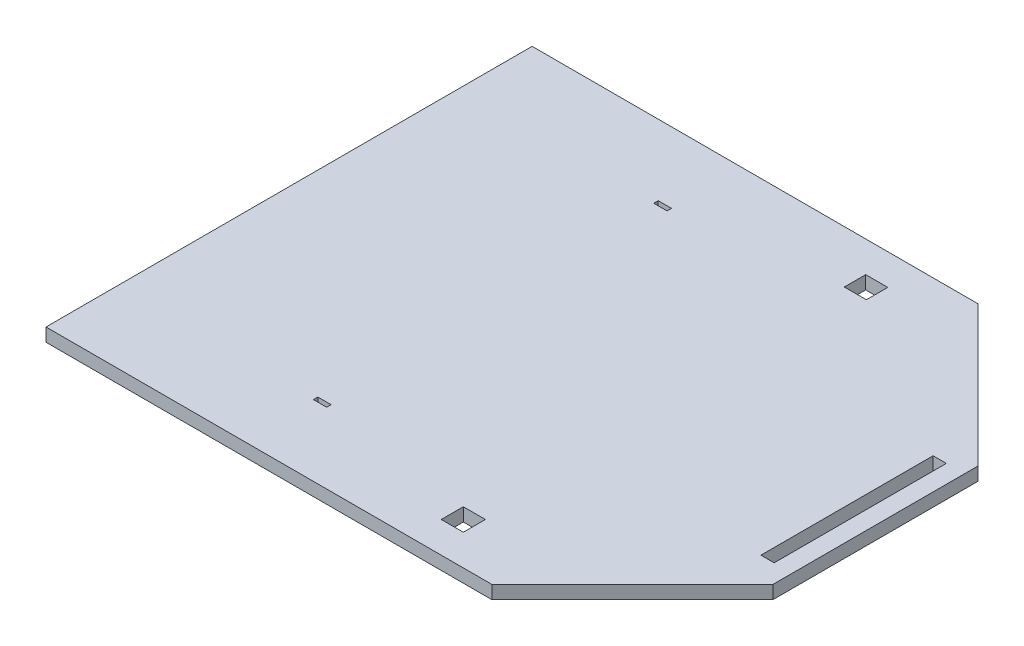
ISO-10303-21;
HEADER;
FILE_DESCRIPTION(('STEP AP214'),'2;1');
FILE_NAME('part.step','',(''),(''),'','','');
FILE_SCHEMA(('AUTOMOTIVE_DESIGN { 1 0 10303 214 1 1 1 1 }'));
ENDSEC;
DATA;
#1=APPLICATION_CONTEXT('core data for automotive mechanical design processes');
#2=APPLICATION_PROTOCOL_DEFINITION('international standard','automotive_design',2000,#1);
#3=PRODUCT_CONTEXT('',#1,'mechanical');
#4=PRODUCT('Part','Part','',(#3));
#5=PRODUCT_RELATED_PRODUCT_CATEGORY('part','',(#4));
#6=PRODUCT_DEFINITION_FORMATION('','',#4);
#7=PRODUCT_DEFINITION_CONTEXT('part definition',#1,'design');
#8=PRODUCT_DEFINITION('design','',#6,#7);
#9=PRODUCT_DEFINITION_SHAPE('','',#8);
#10=(LENGTH_UNIT() NAMED_UNIT(*) SI_UNIT(.MILLI.,.METRE.));
#11=(NAMED_UNIT(*) PLANE_ANGLE_UNIT() SI_UNIT($,.RADIAN.));
#12=(NAMED_UNIT(*) SI_UNIT($,.STERADIAN.) SOLID_ANGLE_UNIT());
#13=UNCERTAINTY_MEASURE_WITH_UNIT(LENGTH_MEASURE(1.E-05),#10,'distance_accuracy_value','');
#14=(GEOMETRIC_REPRESENTATION_CONTEXT(3) GLOBAL_UNCERTAINTY_ASSIGNED_CONTEXT((#13)) GLOBAL_UNIT_ASSIGNED_CONTEXT((#10,
#11,#12)) REPRESENTATION_CONTEXT('',''));
#15=CARTESIAN_POINT('',(0.,0.,0.));
#16=DIRECTION('',(0.,0.,1.));
#17=DIRECTION('',(1.,0.,0.));
#18=AXIS2_PLACEMENT_3D('',#15,#16,#17);
#19=CARTESIAN_POINT('',(0.,3.,0.));
#20=DIRECTION('',(0.,-1.,0.));
#21=DIRECTION('',(0.,0.,-1.));
#22=AXIS2_PLACEMENT_3D('',#19,#20,#21);
#23=PLANE('',#22);
#24=DIRECTION('',(0.,0.,1.));
#25=VECTOR('',#24,1.);
#26=CARTESIAN_POINT('',(38.0418387839541,3.,-84.1097284482659));
#27=LINE('',#26,#25);
#28=CARTESIAN_POINT('',(38.0418387839541,3.,-84.1097284482659));
#29=VERTEX_POINT('',#28);
#30=CARTESIAN_POINT('',(38.0418387839541,3.,-79.2576621948174));
#31=VERTEX_POINT('',#30);
#32=EDGE_CURVE('E242',#29,#31,#27,.T.);
#33=ORIENTED_EDGE('',*,*,#32,.F.);
#34=DIRECTION('',(-1.,0.,0.));
#35=VECTOR('',#34,1.);
#36=CARTESIAN_POINT('',(38.0418387839541,3.,-84.1097284482659));
#37=LINE('',#36,#35);
#38=CARTESIAN_POINT('',(43.0418387839541,3.,-84.1097284482659));
#39=VERTEX_POINT('',#38);
#40=EDGE_CURVE('E250',#39,#29,#37,.T.);
#41=ORIENTED_EDGE('',*,*,#40,.F.);
#42=DIRECTION('',(0.,0.,-1.));
#43=VECTOR('',#42,1.);
#44=CARTESIAN_POINT('',(43.0418387839541,3.,-84.1097284482659));
#45=LINE('',#44,#43);
#46=CARTESIAN_POINT('',(43.0418387839541,3.,-79.2576621948174));
#47=VERTEX_POINT('',#46);
#48=EDGE_CURVE('E247',#47,#39,#45,.T.);
#49=ORIENTED_EDGE('',*,*,#48,.F.);
#50=DIRECTION('',(1.,0.,0.));
#51=VECTOR('',#50,1.);
#52=CARTESIAN_POINT('',(38.0418387839541,3.,-79.2576621948174));
#53=LINE('',#52,#51);
#54=EDGE_CURVE('E244',#31,#47,#53,.T.);
#55=ORIENTED_EDGE('',*,*,#54,.F.);
#56=EDGE_LOOP('',(#33,#41,#49,#55));
#57=FACE_BOUND('',#56,.T.);
#58=DIRECTION('',(0.,0.,1.));
#59=VECTOR('',#58,1.);
#60=CARTESIAN_POINT('',(0.0418387839540746,3.,-75.1097284482659));
#61=LINE('',#60,#59);
#62=CARTESIAN_POINT('',(0.0418387839540746,3.,-75.1097284482659));
#63=VERTEX_POINT('',#62);
#64=CARTESIAN_POINT('',(0.0418387839540742,3.,-74.1097284482659));
#65=VERTEX_POINT('',#64);
#66=EDGE_CURVE('E304',#63,#65,#61,.T.);
#67=ORIENTED_EDGE('',*,*,#66,.F.);
#68=DIRECTION('',(-1.,0.,0.));
#69=VECTOR('',#68,1.);
#70=CARTESIAN_POINT('',(0.0418387839540746,3.,-75.1097284482659));
#71=LINE('',#70,#69);
#72=CARTESIAN_POINT('',(3.04183878395407,3.,-75.1097284482659));
#73=VERTEX_POINT('',#72);
#74=EDGE_CURVE('E312',#73,#63,#71,.T.);
#75=ORIENTED_EDGE('',*,*,#74,.F.);
#76=DIRECTION('',(0.,0.,-1.));
#77=VECTOR('',#76,1.);
#78=CARTESIAN_POINT('',(3.04183878395407,3.,-75.1097284482659));
#79=LINE('',#78,#77);
#80=CARTESIAN_POINT('',(3.04183878395407,3.,-74.1097284482659));
#81=VERTEX_POINT('',#80);
#82=EDGE_CURVE('E309',#81,#73,#79,.T.);
#83=ORIENTED_EDGE('',*,*,#82,.F.);
#84=DIRECTION('',(1.,0.,0.));
#85=VECTOR('',#84,1.);
#86=CARTESIAN_POINT('',(0.0418387839540742,3.,-74.1097284482659));
#87=LINE('',#86,#85);
#88=EDGE_CURVE('E306',#65,#81,#87,.T.);
#89=ORIENTED_EDGE('',*,*,#88,.F.);
#90=EDGE_LOOP('',(#67,#75,#83,#89));
#91=FACE_BOUND('',#90,.T.);
#92=DIRECTION('',(1.,0.,0.));
#93=VECTOR('',#92,1.);
#94=CARTESIAN_POINT('',(56.4572329049881,3.,18.9867210222612));
#95=LINE('',#94,#93);
#96=CARTESIAN_POINT('',(-44.5199360312681,3.,18.9867210222612));
#97=VERTEX_POINT('',#96);
#98=CARTESIAN_POINT('',(56.4572329049881,3.,18.9867210222612));
#99=VERTEX_POINT('',#98);
#100=EDGE_CURVE('E366',#97,#99,#95,.T.);
#101=ORIENTED_EDGE('',*,*,#100,.T.);
#102=DIRECTION('',(0.707106781186551,0.,-0.707106781186544));
#103=VECTOR('',#102,1.);
#104=CARTESIAN_POINT('',(88.2915814195495,3.,-12.8476274922999));
#105=LINE('',#104,#103);
#106=CARTESIAN_POINT('',(88.2915814195495,3.,-12.8476274922999));
#107=VERTEX_POINT('',#106);
#108=EDGE_CURVE('E369',#99,#107,#105,.T.);
#109=ORIENTED_EDGE('',*,*,#108,.T.);
#110=DIRECTION('',(0.,0.,-1.));
#111=VECTOR('',#110,1.);
#112=CARTESIAN_POINT('',(88.2915814195495,3.,-59.2899232948702));
#113=LINE('',#112,#111);
#114=CARTESIAN_POINT('',(88.2915814195495,3.,-59.2899232948702));
#115=VERTEX_POINT('',#114);
#116=EDGE_CURVE('E372',#107,#115,#113,.T.);
#117=ORIENTED_EDGE('',*,*,#116,.T.);
#118=DIRECTION('',(-0.707106781186548,0.,-0.707106781186547));
#119=VECTOR('',#118,1.);
#120=CARTESIAN_POINT('',(56.4717762661537,3.,-91.1097284482659));
#121=LINE('',#120,#119);
#122=CARTESIAN_POINT('',(56.4717762661537,3.,-91.1097284482659));
#123=VERTEX_POINT('',#122);
#124=EDGE_CURVE('E374',#115,#123,#121,.T.);
#125=ORIENTED_EDGE('',*,*,#124,.T.);
#126=DIRECTION('',(-1.,0.,0.));
#127=VECTOR('',#126,1.);
#128=CARTESIAN_POINT('',(-44.5199360312681,3.,-91.1097284482659));
#129=LINE('',#128,#127);
#130=CARTESIAN_POINT('',(-44.5199360312681,3.,-91.1097284482659));
#131=VERTEX_POINT('',#130);
#132=EDGE_CURVE('E376',#123,#131,#129,.T.);
#133=ORIENTED_EDGE('',*,*,#132,.T.);
#134=DIRECTION('',(0.,0.,1.));
#135=VECTOR('',#134,1.);
#136=CARTESIAN_POINT('',(-44.5199360312681,3.,18.9867210222612));
#137=LINE('',#136,#135);
#138=EDGE_CURVE('E378',#131,#97,#137,.T.);
#139=ORIENTED_EDGE('',*,*,#138,.T.);
#140=EDGE_LOOP('',(#101,#109,#117,#125,#133,#139));
#141=FACE_BOUND('',#140,.T.);
#142=DIRECTION('',(0.,0.,1.));
#143=VECTOR('',#142,1.);
#144=CARTESIAN_POINT('',(0.,3.,1.94585934018356));
#145=LINE('',#144,#143);
#146=CARTESIAN_POINT('',(0.,3.,1.94585934018356));
#147=VERTEX_POINT('',#146);
#148=CARTESIAN_POINT('',(0.,3.,2.94585934018356));
#149=VERTEX_POINT('',#148);
#150=EDGE_CURVE('E335',#147,#149,#145,.T.);
#151=ORIENTED_EDGE('',*,*,#150,.F.);
#152=DIRECTION('',(-1.,0.,0.));
#153=VECTOR('',#152,1.);
#154=CARTESIAN_POINT('',(0.,3.,1.94585934018356));
#155=LINE('',#154,#153);
#156=CARTESIAN_POINT('',(3.,3.,1.94585934018356));
#157=VERTEX_POINT('',#156);
#158=EDGE_CURVE('E343',#157,#147,#155,.T.);
#159=ORIENTED_EDGE('',*,*,#158,.F.);
#160=DIRECTION('',(0.,0.,-1.));
#161=VECTOR('',#160,1.);
#162=CARTESIAN_POINT('',(3.,3.,1.94585934018356));
#163=LINE('',#162,#161);
#164=CARTESIAN_POINT('',(3.,3.,2.94585934018356));
#165=VERTEX_POINT('',#164);
#166=EDGE_CURVE('E340',#165,#157,#163,.T.);
#167=ORIENTED_EDGE('',*,*,#166,.F.);
#168=DIRECTION('',(1.,0.,0.));
#169=VECTOR('',#168,1.);
#170=CARTESIAN_POINT('',(0.,3.,2.94585934018356));
#171=LINE('',#170,#169);
#172=EDGE_CURVE('E337',#149,#165,#171,.T.);
#173=ORIENTED_EDGE('',*,*,#172,.F.);
#174=EDGE_LOOP('',(#151,#159,#167,#173));
#175=FACE_BOUND('',#174,.T.);
#176=DIRECTION('',(0.,0.,1.));
#177=VECTOR('',#176,1.);
#178=CARTESIAN_POINT('',(81.1981341241439,3.,-56.2169702862389));
#179=LINE('',#178,#177);
#180=CARTESIAN_POINT('',(81.1981341241439,3.,-56.2169702862389));
#181=VERTEX_POINT('',#180);
#182=CARTESIAN_POINT('',(81.1981341241439,3.,-17.2169702862389));
#183=VERTEX_POINT('',#182);
#184=EDGE_CURVE('E273',#181,#183,#179,.T.);
#185=ORIENTED_EDGE('',*,*,#184,.F.);
#186=DIRECTION('',(-1.,0.,0.));
#187=VECTOR('',#186,1.);
#188=CARTESIAN_POINT('',(81.1981341241439,3.,-56.2169702862389));
#189=LINE('',#188,#187);
#190=CARTESIAN_POINT('',(84.1981341241439,3.,-56.2169702862389));
#191=VERTEX_POINT('',#190);
#192=EDGE_CURVE('E281',#191,#181,#189,.T.);
#193=ORIENTED_EDGE('',*,*,#192,.F.);
#194=DIRECTION('',(0.,0.,-1.));
#195=VECTOR('',#194,1.);
#196=CARTESIAN_POINT('',(84.1981341241439,3.,-56.2169702862389));
#197=LINE('',#196,#195);
#198=CARTESIAN_POINT('',(84.1981341241439,3.,-17.2169702862389));
#199=VERTEX_POINT('',#198);
#200=EDGE_CURVE('E278',#199,#191,#197,.T.);
#201=ORIENTED_EDGE('',*,*,#200,.F.);
#202=DIRECTION('',(1.,0.,0.));
#203=VECTOR('',#202,1.);
#204=CARTESIAN_POINT('',(81.1981341241439,3.,-17.2169702862389));
#205=LINE('',#204,#203);
#206=EDGE_CURVE('E275',#183,#199,#205,.T.);
#207=ORIENTED_EDGE('',*,*,#206,.F.);
#208=EDGE_LOOP('',(#185,#193,#201,#207));
#209=FACE_BOUND('',#208,.T.);
#210=DIRECTION('',(0.,0.,1.));
#211=VECTOR('',#210,1.);
#212=CARTESIAN_POINT('',(38.,3.,6.98672102226119));
#213=LINE('',#212,#211);
#214=CARTESIAN_POINT('',(38.,3.,6.98672102226119));
#215=VERTEX_POINT('',#214);
#216=CARTESIAN_POINT('',(38.,3.,11.9867210222612));
#217=VERTEX_POINT('',#216);
#218=EDGE_CURVE('E206',#215,#217,#213,.T.);
#219=ORIENTED_EDGE('',*,*,#218,.F.);
#220=DIRECTION('',(-1.,0.,0.));
#221=VECTOR('',#220,1.);
#222=CARTESIAN_POINT('',(38.,3.,6.98672102226119));
#223=LINE('',#222,#221);
#224=CARTESIAN_POINT('',(43.,3.,6.98672102226119));
#225=VERTEX_POINT('',#224);
#226=EDGE_CURVE('E228',#225,#215,#223,.T.);
#227=ORIENTED_EDGE('',*,*,#226,.F.);
#228=DIRECTION('',(0.,0.,-1.));
#229=VECTOR('',#228,1.);
#230=CARTESIAN_POINT('',(43.,3.,6.98672102226119));
#231=LINE('',#230,#229);
#232=CARTESIAN_POINT('',(43.,3.,11.9867210222612));
#233=VERTEX_POINT('',#232);
#234=EDGE_CURVE('E226',#233,#225,#231,.T.);
#235=ORIENTED_EDGE('',*,*,#234,.F.);
#236=DIRECTION('',(1.,0.,0.));
#237=VECTOR('',#236,1.);
#238=CARTESIAN_POINT('',(38.,3.,11.9867210222612));
#239=LINE('',#238,#237);
#240=EDGE_CURVE('E214',#217,#233,#239,.T.);
#241=ORIENTED_EDGE('',*,*,#240,.F.);
#242=EDGE_LOOP('',(#219,#227,#235,#241));
#243=FACE_BOUND('',#242,.T.);
#244=ADVANCED_FACE('F33',(#57,#91,#141,#175,#209,#243),#23,.F.);
#245=CARTESIAN_POINT('',(0.,0.,0.));
#246=DIRECTION('',(0.,-1.,0.));
#247=DIRECTION('',(0.,0.,-1.));
#248=AXIS2_PLACEMENT_3D('',#245,#246,#247);
#249=PLANE('',#248);
#250=DIRECTION('',(1.,0.,0.));
#251=VECTOR('',#250,1.);
#252=CARTESIAN_POINT('',(56.4572329049881,0.,18.9867210222612));
#253=LINE('',#252,#251);
#254=CARTESIAN_POINT('',(-44.5199360312681,0.,18.9867210222612));
#255=VERTEX_POINT('',#254);
#256=CARTESIAN_POINT('',(56.4572329049881,0.,18.9867210222612));
#257=VERTEX_POINT('',#256);
#258=EDGE_CURVE('E365',#255,#257,#253,.T.);
#259=ORIENTED_EDGE('',*,*,#258,.F.);
#260=DIRECTION('',(0.,0.,1.));
#261=VECTOR('',#260,1.);
#262=CARTESIAN_POINT('',(-44.5199360312681,0.,18.9867210222612));
#263=LINE('',#262,#261);
#264=CARTESIAN_POINT('',(-44.5199360312681,0.,-91.1097284482659));
#265=VERTEX_POINT('',#264);
#266=EDGE_CURVE('E370',#265,#255,#263,.T.);
#267=ORIENTED_EDGE('',*,*,#266,.F.);
#268=DIRECTION('',(-1.,0.,0.));
#269=VECTOR('',#268,1.);
#270=CARTESIAN_POINT('',(-44.5199360312681,0.,-91.1097284482659));
#271=LINE('',#270,#269);
#272=CARTESIAN_POINT('',(56.4717762661537,0.,-91.1097284482659));
#273=VERTEX_POINT('',#272);
#274=EDGE_CURVE('E389',#273,#265,#271,.T.);
#275=ORIENTED_EDGE('',*,*,#274,.F.);
#276=DIRECTION('',(-0.707106781186548,0.,-0.707106781186547));
#277=VECTOR('',#276,1.);
#278=CARTESIAN_POINT('',(56.4717762661537,0.,-91.1097284482659));
#279=LINE('',#278,#277);
#280=CARTESIAN_POINT('',(88.2915814195495,0.,-59.2899232948702));
#281=VERTEX_POINT('',#280);
#282=EDGE_CURVE('E387',#281,#273,#279,.T.);
#283=ORIENTED_EDGE('',*,*,#282,.F.);
#284=DIRECTION('',(0.,0.,-1.));
#285=VECTOR('',#284,1.);
#286=CARTESIAN_POINT('',(88.2915814195495,0.,-59.2899232948702));
#287=LINE('',#286,#285);
#288=CARTESIAN_POINT('',(88.2915814195495,0.,-12.8476274922999));
#289=VERTEX_POINT('',#288);
#290=EDGE_CURVE('E385',#289,#281,#287,.T.);
#291=ORIENTED_EDGE('',*,*,#290,.F.);
#292=DIRECTION('',(0.707106781186551,0.,-0.707106781186544));
#293=VECTOR('',#292,1.);
#294=CARTESIAN_POINT('',(88.2915814195495,0.,-12.8476274922999));
#295=LINE('',#294,#293);
#296=EDGE_CURVE('E383',#257,#289,#295,.T.);
#297=ORIENTED_EDGE('',*,*,#296,.F.);
#298=EDGE_LOOP('',(#259,#267,#275,#283,#291,#297));
#299=FACE_BOUND('',#298,.T.);
#300=DIRECTION('',(-1.,0.,0.));
#301=VECTOR('',#300,1.);
#302=CARTESIAN_POINT('',(0.,0.,1.94585934018356));
#303=LINE('',#302,#301);
#304=CARTESIAN_POINT('',(3.,0.,1.94585934018356));
#305=VERTEX_POINT('',#304);
#306=CARTESIAN_POINT('',(0.,0.,1.94585934018356));
#307=VERTEX_POINT('',#306);
#308=EDGE_CURVE('E338',#305,#307,#303,.T.);
#309=ORIENTED_EDGE('',*,*,#308,.T.);
#310=DIRECTION('',(0.,0.,1.));
#311=VECTOR('',#310,1.);
#312=CARTESIAN_POINT('',(0.,0.,1.94585934018356));
#313=LINE('',#312,#311);
#314=CARTESIAN_POINT('',(0.,0.,2.94585934018356));
#315=VERTEX_POINT('',#314);
#316=EDGE_CURVE('E334',#307,#315,#313,.T.);
#317=ORIENTED_EDGE('',*,*,#316,.T.);
#318=DIRECTION('',(1.,0.,0.));
#319=VECTOR('',#318,1.);
#320=CARTESIAN_POINT('',(0.,0.,2.94585934018356));
#321=LINE('',#320,#319);
#322=CARTESIAN_POINT('',(3.,0.,2.94585934018356));
#323=VERTEX_POINT('',#322);
#324=EDGE_CURVE('E348',#315,#323,#321,.T.);
#325=ORIENTED_EDGE('',*,*,#324,.T.);
#326=DIRECTION('',(0.,0.,-1.));
#327=VECTOR('',#326,1.);
#328=CARTESIAN_POINT('',(3.,0.,1.94585934018356));
#329=LINE('',#328,#327);
#330=EDGE_CURVE('E351',#323,#305,#329,.T.);
#331=ORIENTED_EDGE('',*,*,#330,.T.);
#332=EDGE_LOOP('',(#309,#317,#325,#331));
#333=FACE_BOUND('',#332,.T.);
#334=DIRECTION('',(-1.,0.,0.));
#335=VECTOR('',#334,1.);
#336=CARTESIAN_POINT('',(0.0418387839540746,0.,-75.1097284482659));
#337=LINE('',#336,#335);
#338=CARTESIAN_POINT('',(3.04183878395407,0.,-75.1097284482659));
#339=VERTEX_POINT('',#338);
#340=CARTESIAN_POINT('',(0.0418387839540746,0.,-75.1097284482659));
#341=VERTEX_POINT('',#340);
#342=EDGE_CURVE('E307',#339,#341,#337,.T.);
#343=ORIENTED_EDGE('',*,*,#342,.T.);
#344=DIRECTION('',(0.,0.,1.));
#345=VECTOR('',#344,1.);
#346=CARTESIAN_POINT('',(0.0418387839540746,0.,-75.1097284482659));
#347=LINE('',#346,#345);
#348=CARTESIAN_POINT('',(0.0418387839540742,0.,-74.1097284482659));
#349=VERTEX_POINT('',#348);
#350=EDGE_CURVE('E303',#341,#349,#347,.T.);
#351=ORIENTED_EDGE('',*,*,#350,.T.);
#352=DIRECTION('',(1.,0.,0.));
#353=VECTOR('',#352,1.);
#354=CARTESIAN_POINT('',(0.0418387839540742,0.,-74.1097284482659));
#355=LINE('',#354,#353);
#356=CARTESIAN_POINT('',(3.04183878395407,0.,-74.1097284482659));
#357=VERTEX_POINT('',#356);
#358=EDGE_CURVE('E317',#349,#357,#355,.T.);
#359=ORIENTED_EDGE('',*,*,#358,.T.);
#360=DIRECTION('',(0.,0.,-1.));
#361=VECTOR('',#360,1.);
#362=CARTESIAN_POINT('',(3.04183878395407,0.,-75.1097284482659));
#363=LINE('',#362,#361);
#364=EDGE_CURVE('E320',#357,#339,#363,.T.);
#365=ORIENTED_EDGE('',*,*,#364,.T.);
#366=EDGE_LOOP('',(#343,#351,#359,#365));
#367=FACE_BOUND('',#366,.T.);
#368=DIRECTION('',(-1.,0.,0.));
#369=VECTOR('',#368,1.);
#370=CARTESIAN_POINT('',(81.1981341241439,0.,-56.2169702862389));
#371=LINE('',#370,#369);
#372=CARTESIAN_POINT('',(84.1981341241439,0.,-56.2169702862389));
#373=VERTEX_POINT('',#372);
#374=CARTESIAN_POINT('',(81.1981341241439,0.,-56.2169702862389));
#375=VERTEX_POINT('',#374);
#376=EDGE_CURVE('E276',#373,#375,#371,.T.);
#377=ORIENTED_EDGE('',*,*,#376,.T.);
#378=DIRECTION('',(0.,0.,1.));
#379=VECTOR('',#378,1.);
#380=CARTESIAN_POINT('',(81.1981341241439,0.,-56.2169702862389));
#381=LINE('',#380,#379);
#382=CARTESIAN_POINT('',(81.1981341241439,0.,-17.2169702862389));
#383=VERTEX_POINT('',#382);
#384=EDGE_CURVE('E272',#375,#383,#381,.T.);
#385=ORIENTED_EDGE('',*,*,#384,.T.);
#386=DIRECTION('',(1.,0.,0.));
#387=VECTOR('',#386,1.);
#388=CARTESIAN_POINT('',(81.1981341241439,0.,-17.2169702862389));
#389=LINE('',#388,#387);
#390=CARTESIAN_POINT('',(84.1981341241439,0.,-17.2169702862389));
#391=VERTEX_POINT('',#390);
#392=EDGE_CURVE('E286',#383,#391,#389,.T.);
#393=ORIENTED_EDGE('',*,*,#392,.T.);
#394=DIRECTION('',(0.,0.,-1.));
#395=VECTOR('',#394,1.);
#396=CARTESIAN_POINT('',(84.1981341241439,0.,-56.2169702862389));
#397=LINE('',#396,#395);
#398=EDGE_CURVE('E289',#391,#373,#397,.T.);
#399=ORIENTED_EDGE('',*,*,#398,.T.);
#400=EDGE_LOOP('',(#377,#385,#393,#399));
#401=FACE_BOUND('',#400,.T.);
#402=DIRECTION('',(-1.,0.,0.));
#403=VECTOR('',#402,1.);
#404=CARTESIAN_POINT('',(38.0418387839541,0.,-84.1097284482659));
#405=LINE('',#404,#403);
#406=CARTESIAN_POINT('',(43.0418387839541,0.,-84.1097284482659));
#407=VERTEX_POINT('',#406);
#408=CARTESIAN_POINT('',(38.0418387839541,0.,-84.1097284482659));
#409=VERTEX_POINT('',#408);
#410=EDGE_CURVE('E245',#407,#409,#405,.T.);
#411=ORIENTED_EDGE('',*,*,#410,.T.);
#412=DIRECTION('',(0.,0.,1.));
#413=VECTOR('',#412,1.);
#414=CARTESIAN_POINT('',(38.0418387839541,0.,-84.1097284482659));
#415=LINE('',#414,#413);
#416=CARTESIAN_POINT('',(38.0418387839541,0.,-79.2576621948174));
#417=VERTEX_POINT('',#416);
#418=EDGE_CURVE('E222',#409,#417,#415,.T.);
#419=ORIENTED_EDGE('',*,*,#418,.T.);
#420=DIRECTION('',(1.,0.,0.));
#421=VECTOR('',#420,1.);
#422=CARTESIAN_POINT('',(38.0418387839541,0.,-79.2576621948174));
#423=LINE('',#422,#421);
#424=CARTESIAN_POINT('',(43.0418387839541,0.,-79.2576621948174));
#425=VERTEX_POINT('',#424);
#426=EDGE_CURVE('E255',#417,#425,#423,.T.);
#427=ORIENTED_EDGE('',*,*,#426,.T.);
#428=DIRECTION('',(0.,0.,-1.));
#429=VECTOR('',#428,1.);
#430=CARTESIAN_POINT('',(43.0418387839541,0.,-84.1097284482659));
#431=LINE('',#430,#429);
#432=EDGE_CURVE('E258',#425,#407,#431,.T.);
#433=ORIENTED_EDGE('',*,*,#432,.T.);
#434=EDGE_LOOP('',(#411,#419,#427,#433));
#435=FACE_BOUND('',#434,.T.);
#436=DIRECTION('',(-1.,0.,0.));
#437=VECTOR('',#436,1.);
#438=CARTESIAN_POINT('',(38.,0.,6.98672102226119));
#439=LINE('',#438,#437);
#440=CARTESIAN_POINT('',(43.,0.,6.98672102226119));
#441=VERTEX_POINT('',#440);
#442=CARTESIAN_POINT('',(38.,0.,6.98672102226119));
#443=VERTEX_POINT('',#442);
#444=EDGE_CURVE('E215',#441,#443,#439,.T.);
#445=ORIENTED_EDGE('',*,*,#444,.T.);
#446=DIRECTION('',(0.,0.,1.));
#447=VECTOR('',#446,1.);
#448=CARTESIAN_POINT('',(38.,0.,6.98672102226119));
#449=LINE('',#448,#447);
#450=CARTESIAN_POINT('',(38.,0.,11.9867210222612));
#451=VERTEX_POINT('',#450);
#452=EDGE_CURVE('E56',#443,#451,#449,.T.);
#453=ORIENTED_EDGE('',*,*,#452,.T.);
#454=DIRECTION('',(1.,0.,0.));
#455=VECTOR('',#454,1.);
#456=CARTESIAN_POINT('',(38.,0.,11.9867210222612));
#457=LINE('',#456,#455);
#458=CARTESIAN_POINT('',(43.,0.,11.9867210222612));
#459=VERTEX_POINT('',#458);
#460=EDGE_CURVE('E221',#451,#459,#457,.T.);
#461=ORIENTED_EDGE('',*,*,#460,.T.);
#462=DIRECTION('',(0.,0.,-1.));
#463=VECTOR('',#462,1.);
#464=CARTESIAN_POINT('',(43.,0.,6.98672102226119));
#465=LINE('',#464,#463);
#466=EDGE_CURVE('E234',#459,#441,#465,.T.);
#467=ORIENTED_EDGE('',*,*,#466,.T.);
#468=EDGE_LOOP('',(#445,#453,#461,#467));
#469=FACE_BOUND('',#468,.T.);
#470=ADVANCED_FACE('F413',(#299,#333,#367,#401,#435,#469),#249,.T.);
#471=CARTESIAN_POINT('',(56.4572329049881,3.,18.9867210222612));
#472=DIRECTION('',(0.,0.,-1.));
#473=DIRECTION('',(-1.,0.,0.));
#474=AXIS2_PLACEMENT_3D('',#471,#472,#473);
#475=PLANE('',#474);
#476=ORIENTED_EDGE('',*,*,#258,.T.);
#477=DIRECTION('',(0.,-1.,0.));
#478=VECTOR('',#477,1.);
#479=CARTESIAN_POINT('',(56.4572329049881,3.,18.9867210222612));
#480=LINE('',#479,#478);
#481=EDGE_CURVE('E11',#99,#257,#480,.T.);
#482=ORIENTED_EDGE('',*,*,#481,.F.);
#483=ORIENTED_EDGE('',*,*,#100,.F.);
#484=DIRECTION('',(0.,-1.,0.));
#485=VECTOR('',#484,1.);
#486=CARTESIAN_POINT('',(-44.5199360312681,3.,18.9867210222612));
#487=LINE('',#486,#485);
#488=EDGE_CURVE('E380',#97,#255,#487,.T.);
#489=ORIENTED_EDGE('',*,*,#488,.T.);
#490=EDGE_LOOP('',(#476,#482,#483,#489));
#491=FACE_BOUND('',#490,.T.);
#492=ADVANCED_FACE('F35',(#491),#475,.F.);
#493=CARTESIAN_POINT('',(88.2915814195495,3.,-12.8476274922999));
#494=DIRECTION('',(-0.707106781186544,0.,-0.707106781186551));
#495=DIRECTION('',(-0.707106781186551,0.,0.707106781186544));
#496=AXIS2_PLACEMENT_3D('',#493,#494,#495);
#497=PLANE('',#496);
#498=ORIENTED_EDGE('',*,*,#296,.T.);
#499=DIRECTION('',(0.,-1.,0.));
#500=VECTOR('',#499,1.);
#501=CARTESIAN_POINT('',(88.2915814195495,3.,-12.8476274922999));
#502=LINE('',#501,#500);
#503=EDGE_CURVE('E41',#107,#289,#502,.T.);
#504=ORIENTED_EDGE('',*,*,#503,.F.);
#505=ORIENTED_EDGE('',*,*,#108,.F.);
#506=ORIENTED_EDGE('',*,*,#481,.T.);
#507=EDGE_LOOP('',(#498,#504,#505,#506));
#508=FACE_BOUND('',#507,.T.);
#509=ADVANCED_FACE('F431',(#508),#497,.F.);
#510=CARTESIAN_POINT('',(88.2915814195495,3.,-59.2899232948702));
#511=DIRECTION('',(-1.,0.,0.));
#512=DIRECTION('',(0.,0.,1.));
#513=AXIS2_PLACEMENT_3D('',#510,#511,#512);
#514=PLANE('',#513);
#515=ORIENTED_EDGE('',*,*,#290,.T.);
#516=DIRECTION('',(0.,-1.,0.));
#517=VECTOR('',#516,1.);
#518=CARTESIAN_POINT('',(88.2915814195495,3.,-59.2899232948702));
#519=LINE('',#518,#517);
#520=EDGE_CURVE('E400',#115,#281,#519,.T.);
#521=ORIENTED_EDGE('',*,*,#520,.F.);
#522=ORIENTED_EDGE('',*,*,#116,.F.);
#523=ORIENTED_EDGE('',*,*,#503,.T.);
#524=EDGE_LOOP('',(#515,#521,#522,#523));
#525=FACE_BOUND('',#524,.T.);
#526=ADVANCED_FACE('F407',(#525),#514,.F.);
#527=CARTESIAN_POINT('',(56.4717762661537,3.,-91.1097284482659));
#528=DIRECTION('',(-0.707106781186547,0.,0.707106781186548));
#529=DIRECTION('',(0.707106781186548,0.,0.707106781186547));
#530=AXIS2_PLACEMENT_3D('',#527,#528,#529);
#531=PLANE('',#530);
#532=ORIENTED_EDGE('',*,*,#282,.T.);
#533=DIRECTION('',(0.,-1.,0.));
#534=VECTOR('',#533,1.);
#535=CARTESIAN_POINT('',(56.4717762661537,3.,-91.1097284482659));
#536=LINE('',#535,#534);
#537=EDGE_CURVE('E397',#123,#273,#536,.T.);
#538=ORIENTED_EDGE('',*,*,#537,.F.);
#539=ORIENTED_EDGE('',*,*,#124,.F.);
#540=ORIENTED_EDGE('',*,*,#520,.T.);
#541=EDGE_LOOP('',(#532,#538,#539,#540));
#542=FACE_BOUND('',#541,.T.);
#543=ADVANCED_FACE('F419',(#542),#531,.F.);
#544=CARTESIAN_POINT('',(-44.5199360312681,3.,-91.1097284482659));
#545=DIRECTION('',(0.,0.,1.));
#546=DIRECTION('',(1.,0.,0.));
#547=AXIS2_PLACEMENT_3D('',#544,#545,#546);
#548=PLANE('',#547);
#549=ORIENTED_EDGE('',*,*,#274,.T.);
#550=DIRECTION('',(0.,-1.,0.));
#551=VECTOR('',#550,1.);
#552=CARTESIAN_POINT('',(-44.5199360312681,3.,-91.1097284482659));
#553=LINE('',#552,#551);
#554=EDGE_CURVE('E394',#131,#265,#553,.T.);
#555=ORIENTED_EDGE('',*,*,#554,.F.);
#556=ORIENTED_EDGE('',*,*,#132,.F.);
#557=ORIENTED_EDGE('',*,*,#537,.T.);
#558=EDGE_LOOP('',(#549,#555,#556,#557));
#559=FACE_BOUND('',#558,.T.);
#560=ADVANCED_FACE('F423',(#559),#548,.F.);
#561=CARTESIAN_POINT('',(-44.5199360312681,3.,18.9867210222612));
#562=DIRECTION('',(1.,0.,0.));
#563=DIRECTION('',(0.,0.,-1.));
#564=AXIS2_PLACEMENT_3D('',#561,#562,#563);
#565=PLANE('',#564);
#566=ORIENTED_EDGE('',*,*,#266,.T.);
#567=ORIENTED_EDGE('',*,*,#488,.F.);
#568=ORIENTED_EDGE('',*,*,#138,.F.);
#569=ORIENTED_EDGE('',*,*,#554,.T.);
#570=EDGE_LOOP('',(#566,#567,#568,#569));
#571=FACE_BOUND('',#570,.T.);
#572=ADVANCED_FACE('F434',(#571),#565,.F.);
#573=CARTESIAN_POINT('',(0.,3.,1.94585934018356));
#574=DIRECTION('',(1.,0.,0.));
#575=DIRECTION('',(0.,0.,-1.));
#576=AXIS2_PLACEMENT_3D('',#573,#574,#575);
#577=PLANE('',#576);
#578=ORIENTED_EDGE('',*,*,#316,.F.);
#579=DIRECTION('',(0.,-1.,0.));
#580=VECTOR('',#579,1.);
#581=CARTESIAN_POINT('',(0.,3.,1.94585934018356));
#582=LINE('',#581,#580);
#583=EDGE_CURVE('E345',#147,#307,#582,.T.);
#584=ORIENTED_EDGE('',*,*,#583,.F.);
#585=ORIENTED_EDGE('',*,*,#150,.T.);
#586=DIRECTION('',(0.,-1.,0.));
#587=VECTOR('',#586,1.);
#588=CARTESIAN_POINT('',(0.,3.,2.94585934018356));
#589=LINE('',#588,#587);
#590=EDGE_CURVE('E362',#149,#315,#589,.T.);
#591=ORIENTED_EDGE('',*,*,#590,.T.);
#592=EDGE_LOOP('',(#578,#584,#585,#591));
#593=FACE_BOUND('',#592,.T.);
#594=ADVANCED_FACE('F436',(#593),#577,.T.);
#595=CARTESIAN_POINT('',(0.,3.,2.94585934018356));
#596=DIRECTION('',(0.,0.,-1.));
#597=DIRECTION('',(-1.,0.,0.));
#598=AXIS2_PLACEMENT_3D('',#595,#596,#597);
#599=PLANE('',#598);
#600=ORIENTED_EDGE('',*,*,#324,.F.);
#601=ORIENTED_EDGE('',*,*,#590,.F.);
#602=ORIENTED_EDGE('',*,*,#172,.T.);
#603=DIRECTION('',(0.,-1.,0.));
#604=VECTOR('',#603,1.);
#605=CARTESIAN_POINT('',(3.,3.,2.94585934018356));
#606=LINE('',#605,#604);
#607=EDGE_CURVE('E360',#165,#323,#606,.T.);
#608=ORIENTED_EDGE('',*,*,#607,.T.);
#609=EDGE_LOOP('',(#600,#601,#602,#608));
#610=FACE_BOUND('',#609,.T.);
#611=ADVANCED_FACE('F442',(#610),#599,.T.);
#612=CARTESIAN_POINT('',(3.,3.,1.94585934018356));
#613=DIRECTION('',(-1.,0.,0.));
#614=DIRECTION('',(0.,0.,1.));
#615=AXIS2_PLACEMENT_3D('',#612,#613,#614);
#616=PLANE('',#615);
#617=ORIENTED_EDGE('',*,*,#330,.F.);
#618=ORIENTED_EDGE('',*,*,#607,.F.);
#619=ORIENTED_EDGE('',*,*,#166,.T.);
#620=DIRECTION('',(0.,-1.,0.));
#621=VECTOR('',#620,1.);
#622=CARTESIAN_POINT('',(3.,3.,1.94585934018356));
#623=LINE('',#622,#621);
#624=EDGE_CURVE('E358',#157,#305,#623,.T.);
#625=ORIENTED_EDGE('',*,*,#624,.T.);
#626=EDGE_LOOP('',(#617,#618,#619,#625));
#627=FACE_BOUND('',#626,.T.);
#628=ADVANCED_FACE('F458',(#627),#616,.T.);
#629=CARTESIAN_POINT('',(0.,3.,1.94585934018356));
#630=DIRECTION('',(0.,0.,1.));
#631=DIRECTION('',(1.,0.,0.));
#632=AXIS2_PLACEMENT_3D('',#629,#630,#631);
#633=PLANE('',#632);
#634=ORIENTED_EDGE('',*,*,#308,.F.);
#635=ORIENTED_EDGE('',*,*,#624,.F.);
#636=ORIENTED_EDGE('',*,*,#158,.T.);
#637=ORIENTED_EDGE('',*,*,#583,.T.);
#638=EDGE_LOOP('',(#634,#635,#636,#637));
#639=FACE_BOUND('',#638,.T.);
#640=ADVANCED_FACE('F462',(#639),#633,.T.);
#641=CARTESIAN_POINT('',(0.0418387839540746,3.,-75.1097284482659));
#642=DIRECTION('',(1.,0.,0.));
#643=DIRECTION('',(0.,0.,-1.));
#644=AXIS2_PLACEMENT_3D('',#641,#642,#643);
#645=PLANE('',#644);
#646=ORIENTED_EDGE('',*,*,#350,.F.);
#647=DIRECTION('',(0.,-1.,0.));
#648=VECTOR('',#647,1.);
#649=CARTESIAN_POINT('',(0.0418387839540746,3.,-75.1097284482659));
#650=LINE('',#649,#648);
#651=EDGE_CURVE('E314',#63,#341,#650,.T.);
#652=ORIENTED_EDGE('',*,*,#651,.F.);
#653=ORIENTED_EDGE('',*,*,#66,.T.);
#654=DIRECTION('',(0.,-1.,0.));
#655=VECTOR('',#654,1.);
#656=CARTESIAN_POINT('',(0.0418387839540742,3.,-74.1097284482659));
#657=LINE('',#656,#655);
#658=EDGE_CURVE('E331',#65,#349,#657,.T.);
#659=ORIENTED_EDGE('',*,*,#658,.T.);
#660=EDGE_LOOP('',(#646,#652,#653,#659));
#661=FACE_BOUND('',#660,.T.);
#662=ADVANCED_FACE('F466',(#661),#645,.T.);
#663=CARTESIAN_POINT('',(0.0418387839540742,3.,-74.1097284482659));
#664=DIRECTION('',(0.,0.,-1.));
#665=DIRECTION('',(-1.,0.,0.));
#666=AXIS2_PLACEMENT_3D('',#663,#664,#665);
#667=PLANE('',#666);
#668=ORIENTED_EDGE('',*,*,#358,.F.);
#669=ORIENTED_EDGE('',*,*,#658,.F.);
#670=ORIENTED_EDGE('',*,*,#88,.T.);
#671=DIRECTION('',(0.,-1.,0.));
#672=VECTOR('',#671,1.);
#673=CARTESIAN_POINT('',(3.04183878395407,3.,-74.1097284482659));
#674=LINE('',#673,#672);
#675=EDGE_CURVE('E329',#81,#357,#674,.T.);
#676=ORIENTED_EDGE('',*,*,#675,.T.);
#677=EDGE_LOOP('',(#668,#669,#670,#676));
#678=FACE_BOUND('',#677,.T.);
#679=ADVANCED_FACE('F470',(#678),#667,.T.);
#680=CARTESIAN_POINT('',(3.04183878395407,3.,-75.1097284482659));
#681=DIRECTION('',(-1.,0.,0.));
#682=DIRECTION('',(0.,0.,1.));
#683=AXIS2_PLACEMENT_3D('',#680,#681,#682);
#684=PLANE('',#683);
#685=ORIENTED_EDGE('',*,*,#364,.F.);
#686=ORIENTED_EDGE('',*,*,#675,.F.);
#687=ORIENTED_EDGE('',*,*,#82,.T.);
#688=DIRECTION('',(0.,-1.,0.));
#689=VECTOR('',#688,1.);
#690=CARTESIAN_POINT('',(3.04183878395407,3.,-75.1097284482659));
#691=LINE('',#690,#689);
#692=EDGE_CURVE('E327',#73,#339,#691,.T.);
#693=ORIENTED_EDGE('',*,*,#692,.T.);
#694=EDGE_LOOP('',(#685,#686,#687,#693));
#695=FACE_BOUND('',#694,.T.);
#696=ADVANCED_FACE('F474',(#695),#684,.T.);
#697=CARTESIAN_POINT('',(0.0418387839540746,3.,-75.1097284482659));
#698=DIRECTION('',(0.,0.,1.));
#699=DIRECTION('',(1.,0.,0.));
#700=AXIS2_PLACEMENT_3D('',#697,#698,#699);
#701=PLANE('',#700);
#702=ORIENTED_EDGE('',*,*,#342,.F.);
#703=ORIENTED_EDGE('',*,*,#692,.F.);
#704=ORIENTED_EDGE('',*,*,#74,.T.);
#705=ORIENTED_EDGE('',*,*,#651,.T.);
#706=EDGE_LOOP('',(#702,#703,#704,#705));
#707=FACE_BOUND('',#706,.T.);
#708=ADVANCED_FACE('F478',(#707),#701,.T.);
#709=CARTESIAN_POINT('',(81.1981341241439,3.,-56.2169702862389));
#710=DIRECTION('',(1.,0.,0.));
#711=DIRECTION('',(0.,0.,-1.));
#712=AXIS2_PLACEMENT_3D('',#709,#710,#711);
#713=PLANE('',#712);
#714=ORIENTED_EDGE('',*,*,#384,.F.);
#715=DIRECTION('',(0.,-1.,0.));
#716=VECTOR('',#715,1.);
#717=CARTESIAN_POINT('',(81.1981341241439,3.,-56.2169702862389));
#718=LINE('',#717,#716);
#719=EDGE_CURVE('E283',#181,#375,#718,.T.);
#720=ORIENTED_EDGE('',*,*,#719,.F.);
#721=ORIENTED_EDGE('',*,*,#184,.T.);
#722=DIRECTION('',(0.,-1.,0.));
#723=VECTOR('',#722,1.);
#724=CARTESIAN_POINT('',(81.1981341241439,3.,-17.2169702862389));
#725=LINE('',#724,#723);
#726=EDGE_CURVE('E300',#183,#383,#725,.T.);
#727=ORIENTED_EDGE('',*,*,#726,.T.);
#728=EDGE_LOOP('',(#714,#720,#721,#727));
#729=FACE_BOUND('',#728,.T.);
#730=ADVANCED_FACE('F482',(#729),#713,.T.);
#731=CARTESIAN_POINT('',(81.1981341241439,3.,-17.2169702862389));
#732=DIRECTION('',(0.,0.,-1.));
#733=DIRECTION('',(-1.,0.,0.));
#734=AXIS2_PLACEMENT_3D('',#731,#732,#733);
#735=PLANE('',#734);
#736=ORIENTED_EDGE('',*,*,#392,.F.);
#737=ORIENTED_EDGE('',*,*,#726,.F.);
#738=ORIENTED_EDGE('',*,*,#206,.T.);
#739=DIRECTION('',(0.,-1.,0.));
#740=VECTOR('',#739,1.);
#741=CARTESIAN_POINT('',(84.1981341241439,3.,-17.2169702862389));
#742=LINE('',#741,#740);
#743=EDGE_CURVE('E298',#199,#391,#742,.T.);
#744=ORIENTED_EDGE('',*,*,#743,.T.);
#745=EDGE_LOOP('',(#736,#737,#738,#744));
#746=FACE_BOUND('',#745,.T.);
#747=ADVANCED_FACE('F486',(#746),#735,.T.);
#748=CARTESIAN_POINT('',(84.1981341241439,3.,-56.2169702862389));
#749=DIRECTION('',(-1.,0.,0.));
#750=DIRECTION('',(0.,0.,1.));
#751=AXIS2_PLACEMENT_3D('',#748,#749,#750);
#752=PLANE('',#751);
#753=ORIENTED_EDGE('',*,*,#398,.F.);
#754=ORIENTED_EDGE('',*,*,#743,.F.);
#755=ORIENTED_EDGE('',*,*,#200,.T.);
#756=DIRECTION('',(0.,-1.,0.));
#757=VECTOR('',#756,1.);
#758=CARTESIAN_POINT('',(84.1981341241439,3.,-56.2169702862389));
#759=LINE('',#758,#757);
#760=EDGE_CURVE('E296',#191,#373,#759,.T.);
#761=ORIENTED_EDGE('',*,*,#760,.T.);
#762=EDGE_LOOP('',(#753,#754,#755,#761));
#763=FACE_BOUND('',#762,.T.);
#764=ADVANCED_FACE('F490',(#763),#752,.T.);
#765=CARTESIAN_POINT('',(81.1981341241439,3.,-56.2169702862389));
#766=DIRECTION('',(0.,0.,1.));
#767=DIRECTION('',(1.,0.,0.));
#768=AXIS2_PLACEMENT_3D('',#765,#766,#767);
#769=PLANE('',#768);
#770=ORIENTED_EDGE('',*,*,#376,.F.);
#771=ORIENTED_EDGE('',*,*,#760,.F.);
#772=ORIENTED_EDGE('',*,*,#192,.T.);
#773=ORIENTED_EDGE('',*,*,#719,.T.);
#774=EDGE_LOOP('',(#770,#771,#772,#773));
#775=FACE_BOUND('',#774,.T.);
#776=ADVANCED_FACE('F494',(#775),#769,.T.);
#777=CARTESIAN_POINT('',(38.0418387839541,3.,-84.1097284482659));
#778=DIRECTION('',(1.,0.,0.));
#779=DIRECTION('',(0.,0.,-1.));
#780=AXIS2_PLACEMENT_3D('',#777,#778,#779);
#781=PLANE('',#780);
#782=ORIENTED_EDGE('',*,*,#418,.F.);
#783=DIRECTION('',(0.,-1.,0.));
#784=VECTOR('',#783,1.);
#785=CARTESIAN_POINT('',(38.0418387839541,3.,-84.1097284482659));
#786=LINE('',#785,#784);
#787=EDGE_CURVE('E252',#29,#409,#786,.T.);
#788=ORIENTED_EDGE('',*,*,#787,.F.);
#789=ORIENTED_EDGE('',*,*,#32,.T.);
#790=DIRECTION('',(0.,-1.,0.));
#791=VECTOR('',#790,1.);
#792=CARTESIAN_POINT('',(38.0418387839541,3.,-79.2576621948174));
#793=LINE('',#792,#791);
#794=EDGE_CURVE('E269',#31,#417,#793,.T.);
#795=ORIENTED_EDGE('',*,*,#794,.T.);
#796=EDGE_LOOP('',(#782,#788,#789,#795));
#797=FACE_BOUND('',#796,.T.);
#798=ADVANCED_FACE('F498',(#797),#781,.T.);
#799=CARTESIAN_POINT('',(38.0418387839541,3.,-79.2576621948174));
#800=DIRECTION('',(0.,0.,-1.));
#801=DIRECTION('',(-1.,0.,0.));
#802=AXIS2_PLACEMENT_3D('',#799,#800,#801);
#803=PLANE('',#802);
#804=ORIENTED_EDGE('',*,*,#426,.F.);
#805=ORIENTED_EDGE('',*,*,#794,.F.);
#806=ORIENTED_EDGE('',*,*,#54,.T.);
#807=DIRECTION('',(0.,-1.,0.));
#808=VECTOR('',#807,1.);
#809=CARTESIAN_POINT('',(43.0418387839541,3.,-79.2576621948174));
#810=LINE('',#809,#808);
#811=EDGE_CURVE('E267',#47,#425,#810,.T.);
#812=ORIENTED_EDGE('',*,*,#811,.T.);
#813=EDGE_LOOP('',(#804,#805,#806,#812));
#814=FACE_BOUND('',#813,.T.);
#815=ADVANCED_FACE('F502',(#814),#803,.T.);
#816=CARTESIAN_POINT('',(43.0418387839541,3.,-84.1097284482659));
#817=DIRECTION('',(-1.,0.,0.));
#818=DIRECTION('',(0.,0.,1.));
#819=AXIS2_PLACEMENT_3D('',#816,#817,#818);
#820=PLANE('',#819);
#821=ORIENTED_EDGE('',*,*,#432,.F.);
#822=ORIENTED_EDGE('',*,*,#811,.F.);
#823=ORIENTED_EDGE('',*,*,#48,.T.);
#824=DIRECTION('',(0.,-1.,0.));
#825=VECTOR('',#824,1.);
#826=CARTESIAN_POINT('',(43.0418387839541,3.,-84.1097284482659));
#827=LINE('',#826,#825);
#828=EDGE_CURVE('E265',#39,#407,#827,.T.);
#829=ORIENTED_EDGE('',*,*,#828,.T.);
#830=EDGE_LOOP('',(#821,#822,#823,#829));
#831=FACE_BOUND('',#830,.T.);
#832=ADVANCED_FACE('F506',(#831),#820,.T.);
#833=CARTESIAN_POINT('',(38.0418387839541,3.,-84.1097284482659));
#834=DIRECTION('',(0.,0.,1.));
#835=DIRECTION('',(1.,0.,0.));
#836=AXIS2_PLACEMENT_3D('',#833,#834,#835);
#837=PLANE('',#836);
#838=ORIENTED_EDGE('',*,*,#410,.F.);
#839=ORIENTED_EDGE('',*,*,#828,.F.);
#840=ORIENTED_EDGE('',*,*,#40,.T.);
#841=ORIENTED_EDGE('',*,*,#787,.T.);
#842=EDGE_LOOP('',(#838,#839,#840,#841));
#843=FACE_BOUND('',#842,.T.);
#844=ADVANCED_FACE('F510',(#843),#837,.T.);
#845=CARTESIAN_POINT('',(38.,3.,6.98672102226119));
#846=DIRECTION('',(1.,0.,0.));
#847=DIRECTION('',(0.,0.,-1.));
#848=AXIS2_PLACEMENT_3D('',#845,#846,#847);
#849=PLANE('',#848);
#850=ORIENTED_EDGE('',*,*,#452,.F.);
#851=DIRECTION('',(0.,-1.,0.));
#852=VECTOR('',#851,1.);
#853=CARTESIAN_POINT('',(38.,3.,6.98672102226119));
#854=LINE('',#853,#852);
#855=EDGE_CURVE('E210',#215,#443,#854,.T.);
#856=ORIENTED_EDGE('',*,*,#855,.F.);
#857=ORIENTED_EDGE('',*,*,#218,.T.);
#858=DIRECTION('',(0.,-1.,0.));
#859=VECTOR('',#858,1.);
#860=CARTESIAN_POINT('',(38.,3.,11.9867210222612));
#861=LINE('',#860,#859);
#862=EDGE_CURVE('E209',#217,#451,#861,.T.);
#863=ORIENTED_EDGE('',*,*,#862,.T.);
#864=EDGE_LOOP('',(#850,#856,#857,#863));
#865=FACE_BOUND('',#864,.T.);
#866=ADVANCED_FACE('F208',(#865),#849,.T.);
#867=CARTESIAN_POINT('',(38.,3.,11.9867210222612));
#868=DIRECTION('',(0.,0.,-1.));
#869=DIRECTION('',(-1.,0.,0.));
#870=AXIS2_PLACEMENT_3D('',#867,#868,#869);
#871=PLANE('',#870);
#872=ORIENTED_EDGE('',*,*,#460,.F.);
#873=ORIENTED_EDGE('',*,*,#862,.F.);
#874=ORIENTED_EDGE('',*,*,#240,.T.);
#875=DIRECTION('',(0.,-1.,0.));
#876=VECTOR('',#875,1.);
#877=CARTESIAN_POINT('',(43.,3.,11.9867210222612));
#878=LINE('',#877,#876);
#879=EDGE_CURVE('E223',#233,#459,#878,.T.);
#880=ORIENTED_EDGE('',*,*,#879,.T.);
#881=EDGE_LOOP('',(#872,#873,#874,#880));
#882=FACE_BOUND('',#881,.T.);
#883=ADVANCED_FACE('F218',(#882),#871,.T.);
#884=CARTESIAN_POINT('',(43.,3.,6.98672102226119));
#885=DIRECTION('',(-1.,0.,0.));
#886=DIRECTION('',(0.,0.,1.));
#887=AXIS2_PLACEMENT_3D('',#884,#885,#886);
#888=PLANE('',#887);
#889=ORIENTED_EDGE('',*,*,#466,.F.);
#890=ORIENTED_EDGE('',*,*,#879,.F.);
#891=ORIENTED_EDGE('',*,*,#234,.T.);
#892=DIRECTION('',(0.,-1.,0.));
#893=VECTOR('',#892,1.);
#894=CARTESIAN_POINT('',(43.,3.,6.98672102226119));
#895=LINE('',#894,#893);
#896=EDGE_CURVE('E48',#225,#441,#895,.T.);
#897=ORIENTED_EDGE('',*,*,#896,.T.);
#898=EDGE_LOOP('',(#889,#890,#891,#897));
#899=FACE_BOUND('',#898,.T.);
#900=ADVANCED_FACE('F519',(#899),#888,.T.);
#901=CARTESIAN_POINT('',(38.,3.,6.98672102226119));
#902=DIRECTION('',(0.,0.,1.));
#903=DIRECTION('',(1.,0.,0.));
#904=AXIS2_PLACEMENT_3D('',#901,#902,#903);
#905=PLANE('',#904);
#906=ORIENTED_EDGE('',*,*,#444,.F.);
#907=ORIENTED_EDGE('',*,*,#896,.F.);
#908=ORIENTED_EDGE('',*,*,#226,.T.);
#909=ORIENTED_EDGE('',*,*,#855,.T.);
#910=EDGE_LOOP('',(#906,#907,#908,#909));
#911=FACE_BOUND('',#910,.T.);
#912=ADVANCED_FACE('F522',(#911),#905,.T.);
#913=CLOSED_SHELL('',(#244,#470,#492,#509,#526,#543,#560,#572,#594,#611,#628,#640,#662,#679,
#696,#708,#730,#747,#764,#776,#798,#815,#832,#844,#866,#883,#900,#912));
#914=MANIFOLD_SOLID_BREP('B2',#913);
#915=ADVANCED_BREP_SHAPE_REPRESENTATION('',(#18,#914),#14);
#916=SHAPE_DEFINITION_REPRESENTATION(#9,#915);
ENDSEC;
END-ISO-10303-21;
